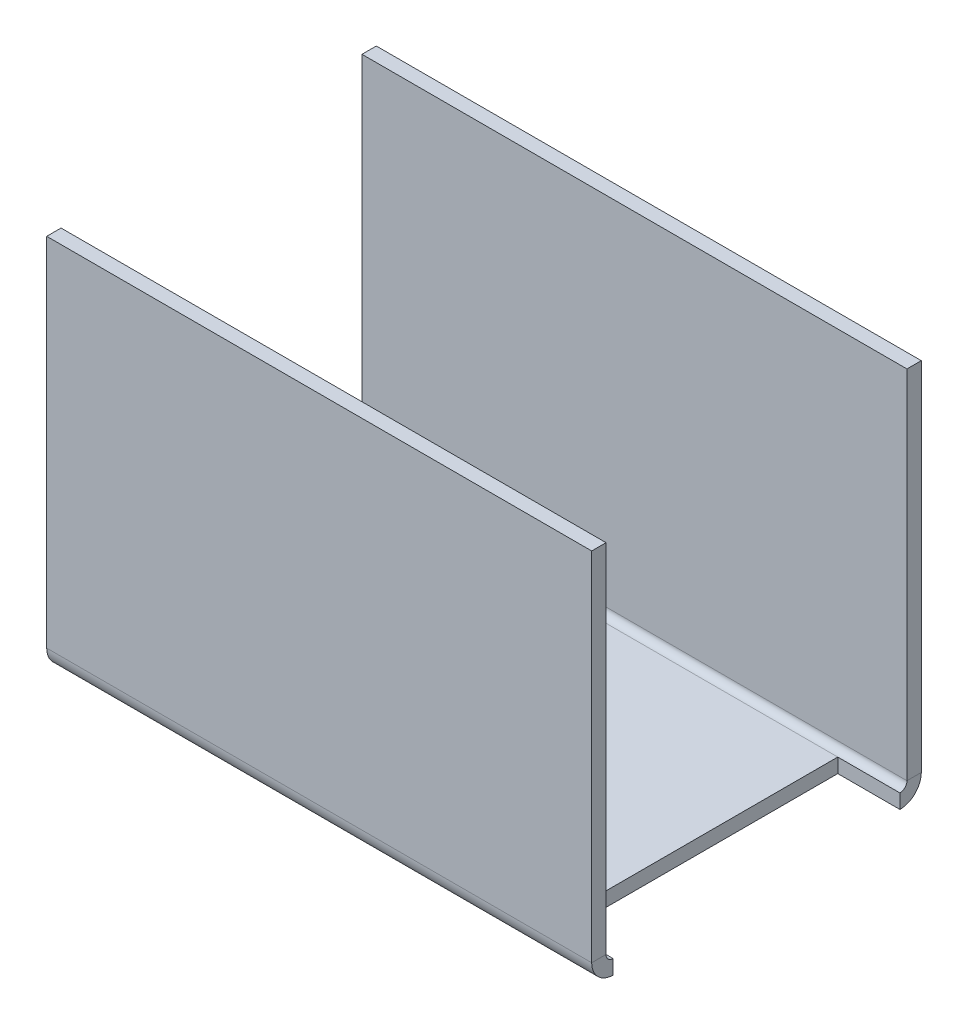
ISO-10303-21;
HEADER;
FILE_DESCRIPTION(('STEP AP214'),'2;1');
FILE_NAME('part.step','',(''),(''),'','','');
FILE_SCHEMA(('AUTOMOTIVE_DESIGN { 1 0 10303 214 1 1 1 1 }'));
ENDSEC;
DATA;
#1=APPLICATION_CONTEXT('core data for automotive mechanical design processes');
#2=APPLICATION_PROTOCOL_DEFINITION('international standard','automotive_design',2000,#1);
#3=PRODUCT_CONTEXT('',#1,'mechanical');
#4=PRODUCT('Part','Part','',(#3));
#5=PRODUCT_RELATED_PRODUCT_CATEGORY('part','',(#4));
#6=PRODUCT_DEFINITION_FORMATION('','',#4);
#7=PRODUCT_DEFINITION_CONTEXT('part definition',#1,'design');
#8=PRODUCT_DEFINITION('design','',#6,#7);
#9=PRODUCT_DEFINITION_SHAPE('','',#8);
#10=(LENGTH_UNIT() NAMED_UNIT(*) SI_UNIT(.MILLI.,.METRE.));
#11=(NAMED_UNIT(*) PLANE_ANGLE_UNIT() SI_UNIT($,.RADIAN.));
#12=(NAMED_UNIT(*) SI_UNIT($,.STERADIAN.) SOLID_ANGLE_UNIT());
#13=UNCERTAINTY_MEASURE_WITH_UNIT(LENGTH_MEASURE(1.E-05),#10,'distance_accuracy_value','');
#14=(GEOMETRIC_REPRESENTATION_CONTEXT(3) GLOBAL_UNCERTAINTY_ASSIGNED_CONTEXT((#13)) GLOBAL_UNIT_ASSIGNED_CONTEXT((#10,
#11,#12)) REPRESENTATION_CONTEXT('',''));
#15=CARTESIAN_POINT('',(0.,0.,0.));
#16=DIRECTION('',(0.,0.,1.));
#17=DIRECTION('',(1.,0.,0.));
#18=AXIS2_PLACEMENT_3D('',#15,#16,#17);
#19=CARTESIAN_POINT('',(0.,0.,0.));
#20=DIRECTION('',(0.,-1.,0.));
#21=DIRECTION('',(0.,0.,-1.));
#22=AXIS2_PLACEMENT_3D('',#19,#20,#21);
#23=PLANE('',#22);
#24=DIRECTION('',(0.,0.,-1.));
#25=VECTOR('',#24,1.);
#26=CARTESIAN_POINT('',(22.,0.,15.));
#27=LINE('',#26,#25);
#28=CARTESIAN_POINT('',(22.,0.,15.));
#29=VERTEX_POINT('',#28);
#30=CARTESIAN_POINT('',(22.,0.,-15.));
#31=VERTEX_POINT('',#30);
#32=EDGE_CURVE('E244',#29,#31,#27,.T.);
#33=ORIENTED_EDGE('',*,*,#32,.T.);
#34=DIRECTION('',(-1.,0.,0.));
#35=VECTOR('',#34,1.);
#36=CARTESIAN_POINT('',(0.,0.,-15.));
#37=LINE('',#36,#35);
#38=CARTESIAN_POINT('',(-22.,0.,-15.));
#39=VERTEX_POINT('',#38);
#40=EDGE_CURVE('E58',#31,#39,#37,.T.);
#41=ORIENTED_EDGE('',*,*,#40,.T.);
#42=DIRECTION('',(0.,0.,1.));
#43=VECTOR('',#42,1.);
#44=CARTESIAN_POINT('',(-22.,0.,15.));
#45=LINE('',#44,#43);
#46=CARTESIAN_POINT('',(-22.,0.,15.));
#47=VERTEX_POINT('',#46);
#48=EDGE_CURVE('E250',#39,#47,#45,.T.);
#49=ORIENTED_EDGE('',*,*,#48,.T.);
#50=DIRECTION('',(1.,0.,0.));
#51=VECTOR('',#50,1.);
#52=CARTESIAN_POINT('',(0.,0.,15.));
#53=LINE('',#52,#51);
#54=EDGE_CURVE('E247',#47,#29,#53,.T.);
#55=ORIENTED_EDGE('',*,*,#54,.T.);
#56=EDGE_LOOP('',(#33,#41,#49,#55));
#57=FACE_BOUND('',#56,.T.);
#58=ADVANCED_FACE('F51',(#57),#23,.F.);
#59=CARTESIAN_POINT('',(-28.5,38.0366,17.2365999999999));
#60=DIRECTION('',(-1.,0.,0.));
#61=DIRECTION('',(0.,1.,0.));
#62=AXIS2_PLACEMENT_3D('',#59,#60,#61);
#63=PLANE('',#62);
#64=DIRECTION('',(0.,1.,0.));
#65=VECTOR('',#64,1.);
#66=CARTESIAN_POINT('',(-28.5,38.0366,15.7365999999999));
#67=LINE('',#66,#65);
#68=CARTESIAN_POINT('',(-28.4999999999999,0.736600000000004,15.7366));
#69=VERTEX_POINT('',#68);
#70=CARTESIAN_POINT('',(-28.5,38.0366,15.7365999999999));
#71=VERTEX_POINT('',#70);
#72=EDGE_CURVE('E243',#69,#71,#67,.T.);
#73=ORIENTED_EDGE('',*,*,#72,.F.);
#74=DIRECTION('',(0.,0.,1.));
#75=VECTOR('',#74,1.);
#76=CARTESIAN_POINT('',(-28.5,0.736600000000007,17.2366));
#77=LINE('',#76,#75);
#78=CARTESIAN_POINT('',(-28.5,0.736600000000011,17.2366));
#79=VERTEX_POINT('',#78);
#80=EDGE_CURVE('E280',#69,#79,#77,.T.);
#81=ORIENTED_EDGE('',*,*,#80,.T.);
#82=DIRECTION('',(0.,1.,0.));
#83=VECTOR('',#82,1.);
#84=CARTESIAN_POINT('',(-28.5,38.0366,17.2365999999999));
#85=LINE('',#84,#83);
#86=CARTESIAN_POINT('',(-28.5,38.0366,17.2365999999999));
#87=VERTEX_POINT('',#86);
#88=EDGE_CURVE('E267',#79,#87,#85,.T.);
#89=ORIENTED_EDGE('',*,*,#88,.T.);
#90=DIRECTION('',(0.,0.,-1.));
#91=VECTOR('',#90,1.);
#92=CARTESIAN_POINT('',(-28.5,38.0366,17.2365999999999));
#93=LINE('',#92,#91);
#94=EDGE_CURVE('E275',#87,#71,#93,.T.);
#95=ORIENTED_EDGE('',*,*,#94,.T.);
#96=EDGE_LOOP('',(#73,#81,#89,#95));
#97=FACE_BOUND('',#96,.T.);
#98=ADVANCED_FACE('F355',(#97),#63,.T.);
#99=CARTESIAN_POINT('',(28.5,38.0366,17.2365999999999));
#100=DIRECTION('',(1.,0.,0.));
#101=DIRECTION('',(0.,-1.,0.));
#102=AXIS2_PLACEMENT_3D('',#99,#100,#101);
#103=PLANE('',#102);
#104=DIRECTION('',(0.,-1.,0.));
#105=VECTOR('',#104,1.);
#106=CARTESIAN_POINT('',(28.5,38.0366,17.2365999999999));
#107=LINE('',#106,#105);
#108=CARTESIAN_POINT('',(28.5,38.0366,17.2365999999999));
#109=VERTEX_POINT('',#108);
#110=CARTESIAN_POINT('',(28.5,0.736600000000007,17.2366));
#111=VERTEX_POINT('',#110);
#112=EDGE_CURVE('E266',#109,#111,#107,.T.);
#113=ORIENTED_EDGE('',*,*,#112,.T.);
#114=DIRECTION('',(0.,0.,-1.));
#115=VECTOR('',#114,1.);
#116=CARTESIAN_POINT('',(28.5,0.736600000000007,17.2366));
#117=LINE('',#116,#115);
#118=CARTESIAN_POINT('',(28.5,0.736600000000004,15.7366));
#119=VERTEX_POINT('',#118);
#120=EDGE_CURVE('E285',#111,#119,#117,.T.);
#121=ORIENTED_EDGE('',*,*,#120,.T.);
#122=DIRECTION('',(0.,-1.,0.));
#123=VECTOR('',#122,1.);
#124=CARTESIAN_POINT('',(28.5,38.0366,15.7365999999999));
#125=LINE('',#124,#123);
#126=CARTESIAN_POINT('',(28.5,38.0366,15.7365999999999));
#127=VERTEX_POINT('',#126);
#128=EDGE_CURVE('E271',#127,#119,#125,.T.);
#129=ORIENTED_EDGE('',*,*,#128,.F.);
#130=DIRECTION('',(0.,0.,-1.));
#131=VECTOR('',#130,1.);
#132=CARTESIAN_POINT('',(28.5,38.0366,17.2365999999999));
#133=LINE('',#132,#131);
#134=EDGE_CURVE('E272',#109,#127,#133,.T.);
#135=ORIENTED_EDGE('',*,*,#134,.F.);
#136=EDGE_LOOP('',(#113,#121,#129,#135));
#137=FACE_BOUND('',#136,.T.);
#138=ADVANCED_FACE('F344',(#137),#103,.T.);
#139=CARTESIAN_POINT('',(0.,-15.7634,17.2366));
#140=DIRECTION('',(0.,0.,1.));
#141=DIRECTION('',(0.,-1.,0.));
#142=AXIS2_PLACEMENT_3D('',#139,#140,#141);
#143=PLANE('',#142);
#144=ORIENTED_EDGE('',*,*,#88,.F.);
#145=DIRECTION('',(1.,0.,0.));
#146=VECTOR('',#145,1.);
#147=CARTESIAN_POINT('',(0.,0.736600000000007,17.2366));
#148=LINE('',#147,#146);
#149=EDGE_CURVE('E274',#79,#111,#148,.T.);
#150=ORIENTED_EDGE('',*,*,#149,.T.);
#151=ORIENTED_EDGE('',*,*,#112,.F.);
#152=DIRECTION('',(1.,0.,0.));
#153=VECTOR('',#152,1.);
#154=CARTESIAN_POINT('',(-28.5,38.0366,17.2365999999999));
#155=LINE('',#154,#153);
#156=EDGE_CURVE('E263',#87,#109,#155,.T.);
#157=ORIENTED_EDGE('',*,*,#156,.F.);
#158=EDGE_LOOP('',(#144,#150,#151,#157));
#159=FACE_BOUND('',#158,.T.);
#160=ADVANCED_FACE('F349',(#159),#143,.T.);
#161=CARTESIAN_POINT('',(-28.5,38.0366,17.2365999999999));
#162=DIRECTION('',(0.,1.,0.));
#163=DIRECTION('',(1.,0.,0.));
#164=AXIS2_PLACEMENT_3D('',#161,#162,#163);
#165=PLANE('',#164);
#166=DIRECTION('',(1.,0.,0.));
#167=VECTOR('',#166,1.);
#168=CARTESIAN_POINT('',(-28.5,38.0366,15.7365999999999));
#169=LINE('',#168,#167);
#170=EDGE_CURVE('E268',#71,#127,#169,.T.);
#171=ORIENTED_EDGE('',*,*,#170,.F.);
#172=ORIENTED_EDGE('',*,*,#94,.F.);
#173=ORIENTED_EDGE('',*,*,#156,.T.);
#174=ORIENTED_EDGE('',*,*,#134,.T.);
#175=EDGE_LOOP('',(#171,#172,#173,#174));
#176=FACE_BOUND('',#175,.T.);
#177=ADVANCED_FACE('F352',(#176),#165,.T.);
#178=CARTESIAN_POINT('',(0.,-15.7634,15.7366));
#179=DIRECTION('',(0.,0.,1.));
#180=DIRECTION('',(0.,-1.,0.));
#181=AXIS2_PLACEMENT_3D('',#178,#179,#180);
#182=PLANE('',#181);
#183=DIRECTION('',(1.,0.,0.));
#184=VECTOR('',#183,1.);
#185=CARTESIAN_POINT('',(0.,0.7366,15.7366));
#186=LINE('',#185,#184);
#187=EDGE_CURVE('E283',#69,#119,#186,.T.);
#188=ORIENTED_EDGE('',*,*,#187,.F.);
#189=ORIENTED_EDGE('',*,*,#72,.T.);
#190=ORIENTED_EDGE('',*,*,#170,.T.);
#191=ORIENTED_EDGE('',*,*,#128,.T.);
#192=EDGE_LOOP('',(#188,#189,#190,#191));
#193=FACE_BOUND('',#192,.T.);
#194=ADVANCED_FACE('F341',(#193),#182,.F.);
#195=CARTESIAN_POINT('',(0.,-1.5,0.));
#196=DIRECTION('',(0.,-1.,0.));
#197=DIRECTION('',(0.,0.,-1.));
#198=AXIS2_PLACEMENT_3D('',#195,#196,#197);
#199=PLANE('',#198);
#200=DIRECTION('',(-1.,0.,0.));
#201=VECTOR('',#200,1.);
#202=CARTESIAN_POINT('',(0.,-1.5,-15.));
#203=LINE('',#202,#201);
#204=CARTESIAN_POINT('',(22.,-1.5,-15.));
#205=VERTEX_POINT('',#204);
#206=CARTESIAN_POINT('',(-22.,-1.5,-15.));
#207=VERTEX_POINT('',#206);
#208=EDGE_CURVE('E288',#205,#207,#203,.T.);
#209=ORIENTED_EDGE('',*,*,#208,.F.);
#210=DIRECTION('',(0.,0.,-1.));
#211=VECTOR('',#210,1.);
#212=CARTESIAN_POINT('',(22.,-1.5,15.));
#213=LINE('',#212,#211);
#214=CARTESIAN_POINT('',(22.,-1.5,15.));
#215=VERTEX_POINT('',#214);
#216=EDGE_CURVE('E240',#215,#205,#213,.T.);
#217=ORIENTED_EDGE('',*,*,#216,.F.);
#218=DIRECTION('',(1.,0.,0.));
#219=VECTOR('',#218,1.);
#220=CARTESIAN_POINT('',(0.,-1.5,15.));
#221=LINE('',#220,#219);
#222=CARTESIAN_POINT('',(-22.,-1.5,15.));
#223=VERTEX_POINT('',#222);
#224=EDGE_CURVE('E237',#223,#215,#221,.T.);
#225=ORIENTED_EDGE('',*,*,#224,.F.);
#226=DIRECTION('',(0.,0.,1.));
#227=VECTOR('',#226,1.);
#228=CARTESIAN_POINT('',(-22.,-1.5,15.));
#229=LINE('',#228,#227);
#230=EDGE_CURVE('E256',#207,#223,#229,.T.);
#231=ORIENTED_EDGE('',*,*,#230,.F.);
#232=EDGE_LOOP('',(#209,#217,#225,#231));
#233=FACE_BOUND('',#232,.T.);
#234=ADVANCED_FACE('F324',(#233),#199,.T.);
#235=CARTESIAN_POINT('',(-22.,-1.5,15.));
#236=DIRECTION('',(-1.,0.,0.));
#237=DIRECTION('',(0.,0.,1.));
#238=AXIS2_PLACEMENT_3D('',#235,#236,#237);
#239=PLANE('',#238);
#240=ORIENTED_EDGE('',*,*,#48,.F.);
#241=DIRECTION('',(0.,1.,0.));
#242=VECTOR('',#241,1.);
#243=CARTESIAN_POINT('',(-22.,-1.5,-15.));
#244=LINE('',#243,#242);
#245=EDGE_CURVE('E297',#207,#39,#244,.T.);
#246=ORIENTED_EDGE('',*,*,#245,.F.);
#247=ORIENTED_EDGE('',*,*,#230,.T.);
#248=DIRECTION('',(0.,1.,0.));
#249=VECTOR('',#248,1.);
#250=CARTESIAN_POINT('',(-22.,-1.5,15.));
#251=LINE('',#250,#249);
#252=EDGE_CURVE('E253',#223,#47,#251,.T.);
#253=ORIENTED_EDGE('',*,*,#252,.T.);
#254=EDGE_LOOP('',(#240,#246,#247,#253));
#255=FACE_BOUND('',#254,.T.);
#256=ADVANCED_FACE('F311',(#255),#239,.T.);
#257=CARTESIAN_POINT('',(22.,-1.5,15.));
#258=DIRECTION('',(1.,0.,0.));
#259=DIRECTION('',(0.,0.,-1.));
#260=AXIS2_PLACEMENT_3D('',#257,#258,#259);
#261=PLANE('',#260);
#262=ORIENTED_EDGE('',*,*,#32,.F.);
#263=DIRECTION('',(0.,1.,0.));
#264=VECTOR('',#263,1.);
#265=CARTESIAN_POINT('',(22.,-1.5,15.));
#266=LINE('',#265,#264);
#267=EDGE_CURVE('E259',#215,#29,#266,.T.);
#268=ORIENTED_EDGE('',*,*,#267,.F.);
#269=ORIENTED_EDGE('',*,*,#216,.T.);
#270=DIRECTION('',(0.,1.,0.));
#271=VECTOR('',#270,1.);
#272=CARTESIAN_POINT('',(22.,-1.5,-15.));
#273=LINE('',#272,#271);
#274=EDGE_CURVE('E12',#205,#31,#273,.T.);
#275=ORIENTED_EDGE('',*,*,#274,.T.);
#276=EDGE_LOOP('',(#262,#268,#269,#275));
#277=FACE_BOUND('',#276,.T.);
#278=ADVANCED_FACE('F327',(#277),#261,.T.);
#279=CARTESIAN_POINT('',(0.,-1.5,15.));
#280=DIRECTION('',(0.,0.,-1.));
#281=DIRECTION('',(1.,0.,0.));
#282=AXIS2_PLACEMENT_3D('',#279,#280,#281);
#283=PLANE('',#282);
#284=ORIENTED_EDGE('',*,*,#252,.F.);
#285=DIRECTION('',(1.,0.,0.));
#286=VECTOR('',#285,1.);
#287=CARTESIAN_POINT('',(-28.5,-1.5,15.));
#288=LINE('',#287,#286);
#289=CARTESIAN_POINT('',(-28.5,-1.5,15.));
#290=VERTEX_POINT('',#289);
#291=EDGE_CURVE('E223',#290,#223,#288,.T.);
#292=ORIENTED_EDGE('',*,*,#291,.F.);
#293=DIRECTION('',(0.,-1.,0.));
#294=VECTOR('',#293,1.);
#295=CARTESIAN_POINT('',(-28.5,-1.5,15.));
#296=LINE('',#295,#294);
#297=CARTESIAN_POINT('',(-28.4999999999999,0.,15.));
#298=VERTEX_POINT('',#297);
#299=EDGE_CURVE('E235',#298,#290,#296,.T.);
#300=ORIENTED_EDGE('',*,*,#299,.F.);
#301=DIRECTION('',(-1.,0.,0.));
#302=VECTOR('',#301,1.);
#303=CARTESIAN_POINT('',(57.0394600254946,0.,15.));
#304=LINE('',#303,#302);
#305=EDGE_CURVE('E228',#298,#47,#304,.F.);
#306=ORIENTED_EDGE('',*,*,#305,.T.);
#307=EDGE_LOOP('',(#284,#292,#300,#306));
#308=FACE_BOUND('',#307,.T.);
#309=ADVANCED_FACE('F315',(#308),#283,.T.);
#310=CARTESIAN_POINT('',(-28.5,0.7366,15.));
#311=DIRECTION('',(-1.,0.,0.));
#312=DIRECTION('',(0.,0.,1.));
#313=AXIS2_PLACEMENT_3D('',#310,#311,#312);
#314=PLANE('',#313);
#315=ORIENTED_EDGE('',*,*,#80,.F.);
#316=CARTESIAN_POINT('',(-28.5,0.7366,15.));
#317=DIRECTION('',(-1.,0.,0.));
#318=DIRECTION('',(0.,0.,1.));
#319=AXIS2_PLACEMENT_3D('',#316,#317,#318);
#320=CIRCLE('',#319,0.7366);
#321=EDGE_CURVE('E215',#69,#298,#320,.F.);
#322=ORIENTED_EDGE('',*,*,#321,.T.);
#323=ORIENTED_EDGE('',*,*,#299,.T.);
#324=CARTESIAN_POINT('',(-28.5,0.7366,15.));
#325=DIRECTION('',(1.,0.,0.));
#326=DIRECTION('',(0.,0.,1.));
#327=AXIS2_PLACEMENT_3D('',#324,#325,#326);
#328=CIRCLE('',#327,2.2366);
#329=EDGE_CURVE('E218',#79,#290,#328,.T.);
#330=ORIENTED_EDGE('',*,*,#329,.F.);
#331=EDGE_LOOP('',(#315,#322,#323,#330));
#332=FACE_BOUND('',#331,.T.);
#333=ADVANCED_FACE('F357',(#332),#314,.T.);
#334=CARTESIAN_POINT('',(28.5,-1.5,15.));
#335=VERTEX_POINT('',#334);
#336=EDGE_CURVE('E221',#215,#335,#288,.T.);
#337=ORIENTED_EDGE('',*,*,#336,.F.);
#338=ORIENTED_EDGE('',*,*,#267,.T.);
#339=CARTESIAN_POINT('',(28.5,0.,15.));
#340=VERTEX_POINT('',#339);
#341=EDGE_CURVE('E230',#29,#340,#304,.F.);
#342=ORIENTED_EDGE('',*,*,#341,.T.);
#343=DIRECTION('',(0.,-1.,0.));
#344=VECTOR('',#343,1.);
#345=CARTESIAN_POINT('',(28.5,-1.5,15.));
#346=LINE('',#345,#344);
#347=EDGE_CURVE('E227',#340,#335,#346,.T.);
#348=ORIENTED_EDGE('',*,*,#347,.T.);
#349=EDGE_LOOP('',(#337,#338,#342,#348));
#350=FACE_BOUND('',#349,.T.);
#351=ADVANCED_FACE('F330',(#350),#283,.T.);
#352=CARTESIAN_POINT('',(28.5,0.7366,15.));
#353=DIRECTION('',(1.,0.,0.));
#354=DIRECTION('',(0.,0.,-1.));
#355=AXIS2_PLACEMENT_3D('',#352,#353,#354);
#356=PLANE('',#355);
#357=CARTESIAN_POINT('',(28.5,0.7366,15.));
#358=DIRECTION('',(-1.,0.,0.));
#359=DIRECTION('',(0.,0.,1.));
#360=AXIS2_PLACEMENT_3D('',#357,#358,#359);
#361=CIRCLE('',#360,0.7366);
#362=EDGE_CURVE('E222',#340,#119,#361,.T.);
#363=ORIENTED_EDGE('',*,*,#362,.T.);
#364=ORIENTED_EDGE('',*,*,#120,.F.);
#365=CARTESIAN_POINT('',(28.5,0.7366,15.));
#366=DIRECTION('',(-1.,0.,0.));
#367=DIRECTION('',(0.,0.,-1.));
#368=AXIS2_PLACEMENT_3D('',#365,#366,#367);
#369=CIRCLE('',#368,2.2366);
#370=EDGE_CURVE('E73',#335,#111,#369,.T.);
#371=ORIENTED_EDGE('',*,*,#370,.F.);
#372=ORIENTED_EDGE('',*,*,#347,.F.);
#373=EDGE_LOOP('',(#363,#364,#371,#372));
#374=FACE_BOUND('',#373,.T.);
#375=ADVANCED_FACE('F338',(#374),#356,.T.);
#376=CARTESIAN_POINT('',(57.0394600254946,0.7366,15.));
#377=DIRECTION('',(-1.,0.,0.));
#378=DIRECTION('',(0.,0.,1.));
#379=AXIS2_PLACEMENT_3D('',#376,#377,#378);
#380=CYLINDRICAL_SURFACE('',#379,2.2366);
#381=ORIENTED_EDGE('',*,*,#291,.T.);
#382=ORIENTED_EDGE('',*,*,#224,.T.);
#383=ORIENTED_EDGE('',*,*,#336,.T.);
#384=ORIENTED_EDGE('',*,*,#370,.T.);
#385=ORIENTED_EDGE('',*,*,#149,.F.);
#386=ORIENTED_EDGE('',*,*,#329,.T.);
#387=EDGE_LOOP('',(#381,#382,#383,#384,#385,#386));
#388=FACE_BOUND('',#387,.T.);
#389=ADVANCED_FACE('F319',(#388),#380,.T.);
#390=CARTESIAN_POINT('',(57.0394600254946,0.7366,15.));
#391=DIRECTION('',(-1.,0.,0.));
#392=DIRECTION('',(0.,0.,1.));
#393=AXIS2_PLACEMENT_3D('',#390,#391,#392);
#394=CYLINDRICAL_SURFACE('',#393,0.7366);
#395=ORIENTED_EDGE('',*,*,#305,.F.);
#396=ORIENTED_EDGE('',*,*,#321,.F.);
#397=ORIENTED_EDGE('',*,*,#187,.T.);
#398=ORIENTED_EDGE('',*,*,#362,.F.);
#399=ORIENTED_EDGE('',*,*,#341,.F.);
#400=ORIENTED_EDGE('',*,*,#54,.F.);
#401=EDGE_LOOP('',(#395,#396,#397,#398,#399,#400));
#402=FACE_BOUND('',#401,.T.);
#403=ADVANCED_FACE('F334',(#402),#394,.F.);
#404=CARTESIAN_POINT('',(0.,-1.5,-15.));
#405=DIRECTION('',(0.,0.,1.));
#406=DIRECTION('',(-1.,0.,0.));
#407=AXIS2_PLACEMENT_3D('',#404,#405,#406);
#408=PLANE('',#407);
#409=ORIENTED_EDGE('',*,*,#274,.F.);
#410=DIRECTION('',(-1.,0.,0.));
#411=VECTOR('',#410,1.);
#412=CARTESIAN_POINT('',(28.5,-1.5,-15.));
#413=LINE('',#412,#411);
#414=CARTESIAN_POINT('',(28.5,-1.5,-15.));
#415=VERTEX_POINT('',#414);
#416=EDGE_CURVE('E200',#415,#205,#413,.T.);
#417=ORIENTED_EDGE('',*,*,#416,.F.);
#418=DIRECTION('',(0.,-1.,0.));
#419=VECTOR('',#418,1.);
#420=CARTESIAN_POINT('',(28.5,-1.5,-15.));
#421=LINE('',#420,#419);
#422=CARTESIAN_POINT('',(28.4999999999999,0.,-15.));
#423=VERTEX_POINT('',#422);
#424=EDGE_CURVE('E213',#423,#415,#421,.T.);
#425=ORIENTED_EDGE('',*,*,#424,.F.);
#426=DIRECTION('',(1.,0.,0.));
#427=VECTOR('',#426,1.);
#428=CARTESIAN_POINT('',(-57.0394600254946,0.,-15.));
#429=LINE('',#428,#427);
#430=EDGE_CURVE('E65',#423,#31,#429,.F.);
#431=ORIENTED_EDGE('',*,*,#430,.T.);
#432=EDGE_LOOP('',(#409,#417,#425,#431));
#433=FACE_BOUND('',#432,.T.);
#434=ADVANCED_FACE('F456',(#433),#408,.T.);
#435=CARTESIAN_POINT('',(28.5,0.7366,-15.));
#436=DIRECTION('',(1.,0.,0.));
#437=DIRECTION('',(0.,0.,-1.));
#438=AXIS2_PLACEMENT_3D('',#435,#436,#437);
#439=PLANE('',#438);
#440=DIRECTION('',(0.,0.,-1.));
#441=VECTOR('',#440,1.);
#442=CARTESIAN_POINT('',(28.5,0.736600000000007,-17.2366));
#443=LINE('',#442,#441);
#444=CARTESIAN_POINT('',(28.5,0.7366,-15.7366));
#445=VERTEX_POINT('',#444);
#446=CARTESIAN_POINT('',(28.5,0.736600000000011,-17.2366));
#447=VERTEX_POINT('',#446);
#448=EDGE_CURVE('E169',#445,#447,#443,.T.);
#449=ORIENTED_EDGE('',*,*,#448,.F.);
#450=CARTESIAN_POINT('',(28.5,0.7366,-15.));
#451=DIRECTION('',(1.,0.,0.));
#452=DIRECTION('',(0.,0.,-1.));
#453=AXIS2_PLACEMENT_3D('',#450,#451,#452);
#454=CIRCLE('',#453,0.7366);
#455=EDGE_CURVE('E180',#445,#423,#454,.F.);
#456=ORIENTED_EDGE('',*,*,#455,.T.);
#457=ORIENTED_EDGE('',*,*,#424,.T.);
#458=CARTESIAN_POINT('',(28.5,0.7366,-15.));
#459=DIRECTION('',(-1.,0.,0.));
#460=DIRECTION('',(0.,0.,-1.));
#461=AXIS2_PLACEMENT_3D('',#458,#459,#460);
#462=CIRCLE('',#461,2.2366);
#463=EDGE_CURVE('E195',#447,#415,#462,.T.);
#464=ORIENTED_EDGE('',*,*,#463,.F.);
#465=EDGE_LOOP('',(#449,#456,#457,#464));
#466=FACE_BOUND('',#465,.T.);
#467=ADVANCED_FACE('F469',(#466),#439,.T.);
#468=CARTESIAN_POINT('',(-28.5,-1.5,-15.));
#469=VERTEX_POINT('',#468);
#470=EDGE_CURVE('E198',#207,#469,#413,.T.);
#471=ORIENTED_EDGE('',*,*,#470,.F.);
#472=ORIENTED_EDGE('',*,*,#245,.T.);
#473=CARTESIAN_POINT('',(-28.5,0.,-15.));
#474=VERTEX_POINT('',#473);
#475=EDGE_CURVE('E208',#39,#474,#429,.F.);
#476=ORIENTED_EDGE('',*,*,#475,.T.);
#477=DIRECTION('',(0.,-1.,0.));
#478=VECTOR('',#477,1.);
#479=CARTESIAN_POINT('',(-28.5,-1.5,-15.));
#480=LINE('',#479,#478);
#481=EDGE_CURVE('E206',#474,#469,#480,.T.);
#482=ORIENTED_EDGE('',*,*,#481,.T.);
#483=EDGE_LOOP('',(#471,#472,#476,#482));
#484=FACE_BOUND('',#483,.T.);
#485=ADVANCED_FACE('F471',(#484),#408,.T.);
#486=CARTESIAN_POINT('',(-28.5,0.7366,-15.));
#487=DIRECTION('',(-1.,0.,0.));
#488=DIRECTION('',(0.,0.,1.));
#489=AXIS2_PLACEMENT_3D('',#486,#487,#488);
#490=PLANE('',#489);
#491=CARTESIAN_POINT('',(-28.5,0.7366,-15.));
#492=DIRECTION('',(1.,0.,0.));
#493=DIRECTION('',(0.,0.,-1.));
#494=AXIS2_PLACEMENT_3D('',#491,#492,#493);
#495=CIRCLE('',#494,0.7366);
#496=CARTESIAN_POINT('',(-28.5,0.7366,-15.7366));
#497=VERTEX_POINT('',#496);
#498=EDGE_CURVE('E199',#474,#497,#495,.T.);
#499=ORIENTED_EDGE('',*,*,#498,.T.);
#500=DIRECTION('',(0.,0.,1.));
#501=VECTOR('',#500,1.);
#502=CARTESIAN_POINT('',(-28.5,0.736600000000007,-17.2366));
#503=LINE('',#502,#501);
#504=CARTESIAN_POINT('',(-28.5,0.736600000000007,-17.2366));
#505=VERTEX_POINT('',#504);
#506=EDGE_CURVE('E649',#505,#497,#503,.T.);
#507=ORIENTED_EDGE('',*,*,#506,.F.);
#508=CARTESIAN_POINT('',(-28.5,0.7366,-15.));
#509=DIRECTION('',(1.,0.,0.));
#510=DIRECTION('',(0.,0.,1.));
#511=AXIS2_PLACEMENT_3D('',#508,#509,#510);
#512=CIRCLE('',#511,2.2366);
#513=EDGE_CURVE('E203',#469,#505,#512,.T.);
#514=ORIENTED_EDGE('',*,*,#513,.F.);
#515=ORIENTED_EDGE('',*,*,#481,.F.);
#516=EDGE_LOOP('',(#499,#507,#514,#515));
#517=FACE_BOUND('',#516,.T.);
#518=ADVANCED_FACE('F487',(#517),#490,.T.);
#519=CARTESIAN_POINT('',(-57.0394600254946,0.7366,-15.));
#520=DIRECTION('',(1.,0.,0.));
#521=DIRECTION('',(0.,0.,-1.));
#522=AXIS2_PLACEMENT_3D('',#519,#520,#521);
#523=CYLINDRICAL_SURFACE('',#522,2.2366);
#524=ORIENTED_EDGE('',*,*,#416,.T.);
#525=ORIENTED_EDGE('',*,*,#208,.T.);
#526=ORIENTED_EDGE('',*,*,#470,.T.);
#527=ORIENTED_EDGE('',*,*,#513,.T.);
#528=DIRECTION('',(-1.,0.,0.));
#529=VECTOR('',#528,1.);
#530=CARTESIAN_POINT('',(0.,0.736600000000007,-17.2366));
#531=LINE('',#530,#529);
#532=EDGE_CURVE('E189',#447,#505,#531,.T.);
#533=ORIENTED_EDGE('',*,*,#532,.F.);
#534=ORIENTED_EDGE('',*,*,#463,.T.);
#535=EDGE_LOOP('',(#524,#525,#526,#527,#533,#534));
#536=FACE_BOUND('',#535,.T.);
#537=ADVANCED_FACE('F494',(#536),#523,.T.);
#538=CARTESIAN_POINT('',(-57.0394600254946,0.7366,-15.));
#539=DIRECTION('',(1.,0.,0.));
#540=DIRECTION('',(0.,0.,-1.));
#541=AXIS2_PLACEMENT_3D('',#538,#539,#540);
#542=CYLINDRICAL_SURFACE('',#541,0.7366);
#543=ORIENTED_EDGE('',*,*,#430,.F.);
#544=ORIENTED_EDGE('',*,*,#455,.F.);
#545=DIRECTION('',(-1.,0.,0.));
#546=VECTOR('',#545,1.);
#547=CARTESIAN_POINT('',(0.,0.7366,-15.7366));
#548=LINE('',#547,#546);
#549=EDGE_CURVE('E187',#445,#497,#548,.T.);
#550=ORIENTED_EDGE('',*,*,#549,.T.);
#551=ORIENTED_EDGE('',*,*,#498,.F.);
#552=ORIENTED_EDGE('',*,*,#475,.F.);
#553=ORIENTED_EDGE('',*,*,#40,.F.);
#554=EDGE_LOOP('',(#543,#544,#550,#551,#552,#553));
#555=FACE_BOUND('',#554,.T.);
#556=ADVANCED_FACE('F304',(#555),#542,.F.);
#557=CARTESIAN_POINT('',(-28.5,38.0366,-17.2365999999999));
#558=DIRECTION('',(0.,1.,0.));
#559=DIRECTION('',(-1.,0.,0.));
#560=AXIS2_PLACEMENT_3D('',#557,#558,#559);
#561=PLANE('',#560);
#562=DIRECTION('',(-1.,0.,0.));
#563=VECTOR('',#562,1.);
#564=CARTESIAN_POINT('',(-28.5,38.0366,-15.7365999999999));
#565=LINE('',#564,#563);
#566=CARTESIAN_POINT('',(28.5,38.0366,-15.7365999999999));
#567=VERTEX_POINT('',#566);
#568=CARTESIAN_POINT('',(-28.5,38.0366,-15.7365999999999));
#569=VERTEX_POINT('',#568);
#570=EDGE_CURVE('E179',#567,#569,#565,.T.);
#571=ORIENTED_EDGE('',*,*,#570,.F.);
#572=DIRECTION('',(0.,0.,1.));
#573=VECTOR('',#572,1.);
#574=CARTESIAN_POINT('',(28.5,38.0366,-17.2365999999999));
#575=LINE('',#574,#573);
#576=CARTESIAN_POINT('',(28.5,38.0366,-17.2365999999999));
#577=VERTEX_POINT('',#576);
#578=EDGE_CURVE('E166',#577,#567,#575,.T.);
#579=ORIENTED_EDGE('',*,*,#578,.F.);
#580=DIRECTION('',(-1.,0.,0.));
#581=VECTOR('',#580,1.);
#582=CARTESIAN_POINT('',(-28.5,38.0366,-17.2365999999999));
#583=LINE('',#582,#581);
#584=CARTESIAN_POINT('',(-28.5,38.0366,-17.2365999999999));
#585=VERTEX_POINT('',#584);
#586=EDGE_CURVE('E177',#577,#585,#583,.T.);
#587=ORIENTED_EDGE('',*,*,#586,.T.);
#588=DIRECTION('',(0.,0.,1.));
#589=VECTOR('',#588,1.);
#590=CARTESIAN_POINT('',(-28.5,38.0366,-17.2365999999999));
#591=LINE('',#590,#589);
#592=EDGE_CURVE('E186',#585,#569,#591,.T.);
#593=ORIENTED_EDGE('',*,*,#592,.T.);
#594=EDGE_LOOP('',(#571,#579,#587,#593));
#595=FACE_BOUND('',#594,.T.);
#596=ADVANCED_FACE('F176',(#595),#561,.T.);
#597=CARTESIAN_POINT('',(0.,-15.7634,-17.2366000000001));
#598=DIRECTION('',(0.,0.,-1.));
#599=DIRECTION('',(0.,1.,0.));
#600=AXIS2_PLACEMENT_3D('',#597,#598,#599);
#601=PLANE('',#600);
#602=DIRECTION('',(0.,1.,0.));
#603=VECTOR('',#602,1.);
#604=CARTESIAN_POINT('',(28.5,-0.76340000000001,-17.2366));
#605=LINE('',#604,#603);
#606=EDGE_CURVE('E163',#447,#577,#605,.T.);
#607=ORIENTED_EDGE('',*,*,#606,.F.);
#608=ORIENTED_EDGE('',*,*,#532,.T.);
#609=DIRECTION('',(0.,-1.,0.));
#610=VECTOR('',#609,1.);
#611=CARTESIAN_POINT('',(-28.5,-0.76340000000001,-17.2366));
#612=LINE('',#611,#610);
#613=EDGE_CURVE('E185',#585,#505,#612,.T.);
#614=ORIENTED_EDGE('',*,*,#613,.F.);
#615=ORIENTED_EDGE('',*,*,#586,.F.);
#616=EDGE_LOOP('',(#607,#608,#614,#615));
#617=FACE_BOUND('',#616,.T.);
#618=ADVANCED_FACE('F183',(#617),#601,.T.);
#619=CARTESIAN_POINT('',(-28.5,-0.76340000000001,-17.2366));
#620=DIRECTION('',(-1.,0.,0.));
#621=DIRECTION('',(0.,-1.,0.));
#622=AXIS2_PLACEMENT_3D('',#619,#620,#621);
#623=PLANE('',#622);
#624=ORIENTED_EDGE('',*,*,#613,.T.);
#625=ORIENTED_EDGE('',*,*,#506,.T.);
#626=DIRECTION('',(0.,-1.,0.));
#627=VECTOR('',#626,1.);
#628=CARTESIAN_POINT('',(-28.5,-0.763400000000015,-15.7366));
#629=LINE('',#628,#627);
#630=EDGE_CURVE('E641',#569,#497,#629,.T.);
#631=ORIENTED_EDGE('',*,*,#630,.F.);
#632=ORIENTED_EDGE('',*,*,#592,.F.);
#633=EDGE_LOOP('',(#624,#625,#631,#632));
#634=FACE_BOUND('',#633,.T.);
#635=ADVANCED_FACE('F524',(#634),#623,.T.);
#636=CARTESIAN_POINT('',(0.,-15.7634,-15.7366000000001));
#637=DIRECTION('',(0.,0.,-1.));
#638=DIRECTION('',(0.,1.,0.));
#639=AXIS2_PLACEMENT_3D('',#636,#637,#638);
#640=PLANE('',#639);
#641=ORIENTED_EDGE('',*,*,#549,.F.);
#642=DIRECTION('',(0.,1.,0.));
#643=VECTOR('',#642,1.);
#644=CARTESIAN_POINT('',(28.5,-0.763400000000015,-15.7366));
#645=LINE('',#644,#643);
#646=EDGE_CURVE('E639',#445,#567,#645,.T.);
#647=ORIENTED_EDGE('',*,*,#646,.T.);
#648=ORIENTED_EDGE('',*,*,#570,.T.);
#649=ORIENTED_EDGE('',*,*,#630,.T.);
#650=EDGE_LOOP('',(#641,#647,#648,#649));
#651=FACE_BOUND('',#650,.T.);
#652=ADVANCED_FACE('F532',(#651),#640,.F.);
#653=CARTESIAN_POINT('',(28.5,-0.76340000000001,-17.2366));
#654=DIRECTION('',(1.,0.,0.));
#655=DIRECTION('',(0.,1.,0.));
#656=AXIS2_PLACEMENT_3D('',#653,#654,#655);
#657=PLANE('',#656);
#658=ORIENTED_EDGE('',*,*,#646,.F.);
#659=ORIENTED_EDGE('',*,*,#448,.T.);
#660=ORIENTED_EDGE('',*,*,#606,.T.);
#661=ORIENTED_EDGE('',*,*,#578,.T.);
#662=EDGE_LOOP('',(#658,#659,#660,#661));
#663=FACE_BOUND('',#662,.T.);
#664=ADVANCED_FACE('F165',(#663),#657,.T.);
#665=CLOSED_SHELL('',(#58,#98,#138,#160,#177,#194,#234,#256,#278,#309,#333,#351,#375,#389,#403,
#434,#467,#485,#518,#537,#556,#596,#618,#635,#652,#664));
#666=MANIFOLD_SOLID_BREP('B2',#665);
#667=ADVANCED_BREP_SHAPE_REPRESENTATION('',(#18,#666),#14);
#668=SHAPE_DEFINITION_REPRESENTATION(#9,#667);
ENDSEC;
END-ISO-10303-21;
